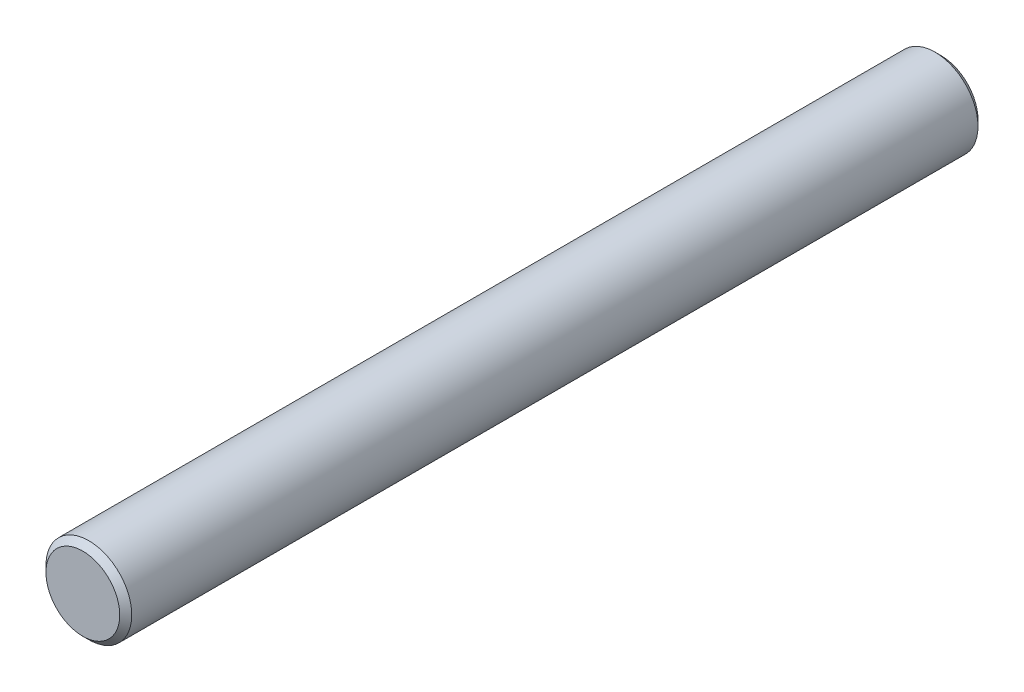
ISO-10303-21;
HEADER;
FILE_DESCRIPTION(('STEP AP214'),'2;1');
FILE_NAME('part.step','',(''),(''),'','','');
FILE_SCHEMA(('AUTOMOTIVE_DESIGN { 1 0 10303 214 1 1 1 1 }'));
ENDSEC;
DATA;
#1=APPLICATION_CONTEXT('core data for automotive mechanical design processes');
#2=APPLICATION_PROTOCOL_DEFINITION('international standard','automotive_design',2000,#1);
#3=PRODUCT_CONTEXT('',#1,'mechanical');
#4=PRODUCT('Part','Part','',(#3));
#5=PRODUCT_RELATED_PRODUCT_CATEGORY('part','',(#4));
#6=PRODUCT_DEFINITION_FORMATION('','',#4);
#7=PRODUCT_DEFINITION_CONTEXT('part definition',#1,'design');
#8=PRODUCT_DEFINITION('design','',#6,#7);
#9=PRODUCT_DEFINITION_SHAPE('','',#8);
#10=(LENGTH_UNIT() NAMED_UNIT(*) SI_UNIT(.MILLI.,.METRE.));
#11=(NAMED_UNIT(*) PLANE_ANGLE_UNIT() SI_UNIT($,.RADIAN.));
#12=(NAMED_UNIT(*) SI_UNIT($,.STERADIAN.) SOLID_ANGLE_UNIT());
#13=UNCERTAINTY_MEASURE_WITH_UNIT(LENGTH_MEASURE(1.E-05),#10,'distance_accuracy_value','');
#14=(GEOMETRIC_REPRESENTATION_CONTEXT(3) GLOBAL_UNCERTAINTY_ASSIGNED_CONTEXT((#13)) GLOBAL_UNIT_ASSIGNED_CONTEXT((#10,
#11,#12)) REPRESENTATION_CONTEXT('',''));
#15=CARTESIAN_POINT('',(0.,0.,0.));
#16=DIRECTION('',(0.,0.,1.));
#17=DIRECTION('',(1.,0.,0.));
#18=AXIS2_PLACEMENT_3D('',#15,#16,#17);
#19=CARTESIAN_POINT('',(0.,0.,25.));
#20=DIRECTION('',(0.,0.,-1.));
#21=DIRECTION('',(-1.,0.,0.));
#22=AXIS2_PLACEMENT_3D('',#19,#20,#21);
#23=CYLINDRICAL_SURFACE('',#22,2.5);
#24=CARTESIAN_POINT('',(0.,0.,-24.65));
#25=DIRECTION('',(0.,0.,1.));
#26=DIRECTION('',(1.,0.,0.));
#27=AXIS2_PLACEMENT_3D('',#24,#25,#26);
#28=CIRCLE('',#27,2.5);
#29=CARTESIAN_POINT('',(2.5,0.,-24.65));
#30=VERTEX_POINT('',#29);
#31=EDGE_CURVE('E41',#30,#30,#28,.T.);
#32=ORIENTED_EDGE('',*,*,#31,.T.);
#33=EDGE_LOOP('',(#32));
#34=FACE_BOUND('',#33,.T.);
#35=CARTESIAN_POINT('',(0.,0.,24.65));
#36=DIRECTION('',(0.,0.,1.));
#37=DIRECTION('',(1.,0.,0.));
#38=AXIS2_PLACEMENT_3D('',#35,#36,#37);
#39=CIRCLE('',#38,2.5);
#40=CARTESIAN_POINT('',(2.5,0.,24.65));
#41=VERTEX_POINT('',#40);
#42=EDGE_CURVE('E45',#41,#41,#39,.F.);
#43=ORIENTED_EDGE('',*,*,#42,.T.);
#44=EDGE_LOOP('',(#43));
#45=FACE_BOUND('',#44,.T.);
#46=ADVANCED_FACE('F30',(#34,#45),#23,.T.);
#47=CARTESIAN_POINT('',(0.,0.,25.));
#48=DIRECTION('',(0.,0.,1.));
#49=DIRECTION('',(1.,0.,0.));
#50=AXIS2_PLACEMENT_3D('',#47,#48,#49);
#51=PLANE('',#50);
#52=CARTESIAN_POINT('',(0.,0.,25.));
#53=DIRECTION('',(0.,0.,1.));
#54=DIRECTION('',(1.,0.,0.));
#55=AXIS2_PLACEMENT_3D('',#52,#53,#54);
#56=CIRCLE('',#55,2.15000000000001);
#57=CARTESIAN_POINT('',(2.15000000000001,0.,25.));
#58=VERTEX_POINT('',#57);
#59=EDGE_CURVE('E10',#58,#58,#56,.T.);
#60=ORIENTED_EDGE('',*,*,#59,.T.);
#61=EDGE_LOOP('',(#60));
#62=FACE_BOUND('',#61,.T.);
#63=ADVANCED_FACE('F61',(#62),#51,.T.);
#64=CARTESIAN_POINT('',(0.,0.,-25.));
#65=DIRECTION('',(0.,0.,1.));
#66=DIRECTION('',(1.,0.,0.));
#67=AXIS2_PLACEMENT_3D('',#64,#65,#66);
#68=PLANE('',#67);
#69=CARTESIAN_POINT('',(0.,0.,-25.));
#70=DIRECTION('',(0.,0.,1.));
#71=DIRECTION('',(1.,0.,0.));
#72=AXIS2_PLACEMENT_3D('',#69,#70,#71);
#73=CIRCLE('',#72,2.15);
#74=CARTESIAN_POINT('',(2.15,0.,-25.));
#75=VERTEX_POINT('',#74);
#76=EDGE_CURVE('E37',#75,#75,#73,.F.);
#77=ORIENTED_EDGE('',*,*,#76,.T.);
#78=EDGE_LOOP('',(#77));
#79=FACE_BOUND('',#78,.T.);
#80=ADVANCED_FACE('F58',(#79),#68,.F.);
#81=CARTESIAN_POINT('',(0.,0.,-24.65));
#82=DIRECTION('',(0.,0.,1.));
#83=DIRECTION('',(1.,0.,0.));
#84=AXIS2_PLACEMENT_3D('',#81,#82,#83);
#85=CONICAL_SURFACE('',#84,2.5,0.785398163397445);
#86=ORIENTED_EDGE('',*,*,#76,.F.);
#87=EDGE_LOOP('',(#86));
#88=FACE_BOUND('',#87,.T.);
#89=ORIENTED_EDGE('',*,*,#31,.F.);
#90=EDGE_LOOP('',(#89));
#91=FACE_BOUND('',#90,.T.);
#92=ADVANCED_FACE('F54',(#88,#91),#85,.T.);
#93=CARTESIAN_POINT('',(0.,0.,25.));
#94=DIRECTION('',(0.,0.,-1.));
#95=DIRECTION('',(-1.,0.,0.));
#96=AXIS2_PLACEMENT_3D('',#93,#94,#95);
#97=CONICAL_SURFACE('',#96,2.15000000000001,0.785398163397455);
#98=ORIENTED_EDGE('',*,*,#42,.F.);
#99=EDGE_LOOP('',(#98));
#100=FACE_BOUND('',#99,.T.);
#101=ORIENTED_EDGE('',*,*,#59,.F.);
#102=EDGE_LOOP('',(#101));
#103=FACE_BOUND('',#102,.T.);
#104=ADVANCED_FACE('F32',(#100,#103),#97,.T.);
#105=CLOSED_SHELL('',(#46,#63,#80,#92,#104));
#106=MANIFOLD_SOLID_BREP('B2',#105);
#107=ADVANCED_BREP_SHAPE_REPRESENTATION('',(#18,#106),#14);
#108=SHAPE_DEFINITION_REPRESENTATION(#9,#107);
ENDSEC;
END-ISO-10303-21;
